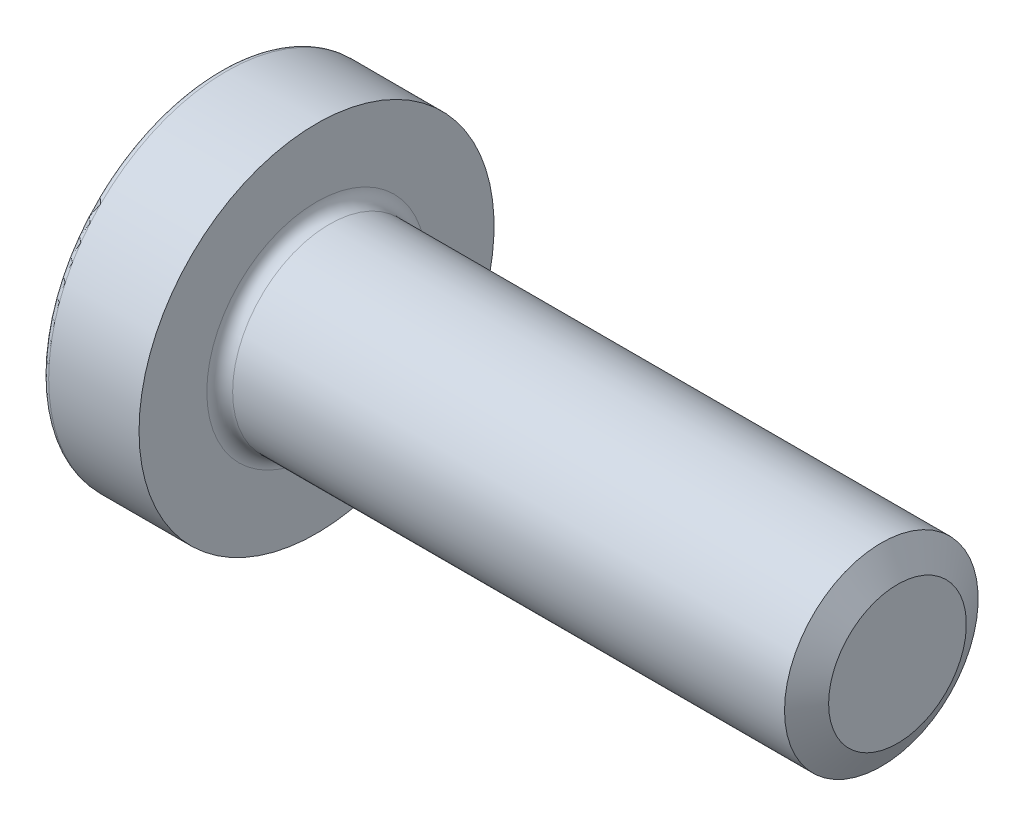
ISO-10303-21;
HEADER;
FILE_DESCRIPTION(('STEP AP214'),'2;1');
FILE_NAME('part.step','',(''),(''),'','','');
FILE_SCHEMA(('AUTOMOTIVE_DESIGN { 1 0 10303 214 1 1 1 1 }'));
ENDSEC;
DATA;
#1=APPLICATION_CONTEXT('core data for automotive mechanical design processes');
#2=APPLICATION_PROTOCOL_DEFINITION('international standard','automotive_design',2000,#1);
#3=PRODUCT_CONTEXT('',#1,'mechanical');
#4=PRODUCT('Part','Part','',(#3));
#5=PRODUCT_RELATED_PRODUCT_CATEGORY('part','',(#4));
#6=PRODUCT_DEFINITION_FORMATION('','',#4);
#7=PRODUCT_DEFINITION_CONTEXT('part definition',#1,'design');
#8=PRODUCT_DEFINITION('design','',#6,#7);
#9=PRODUCT_DEFINITION_SHAPE('','',#8);
#10=(LENGTH_UNIT() NAMED_UNIT(*) SI_UNIT(.MILLI.,.METRE.));
#11=(NAMED_UNIT(*) PLANE_ANGLE_UNIT() SI_UNIT($,.RADIAN.));
#12=(NAMED_UNIT(*) SI_UNIT($,.STERADIAN.) SOLID_ANGLE_UNIT());
#13=UNCERTAINTY_MEASURE_WITH_UNIT(LENGTH_MEASURE(1.E-05),#10,'distance_accuracy_value','');
#14=(GEOMETRIC_REPRESENTATION_CONTEXT(3) GLOBAL_UNCERTAINTY_ASSIGNED_CONTEXT((#13)) GLOBAL_UNIT_ASSIGNED_CONTEXT((#10,
#11,#12)) REPRESENTATION_CONTEXT('',''));
#15=CARTESIAN_POINT('',(0.,0.,0.));
#16=DIRECTION('',(0.,0.,1.));
#17=DIRECTION('',(1.,0.,0.));
#18=AXIS2_PLACEMENT_3D('',#15,#16,#17);
#19=CARTESIAN_POINT('',(0.,0.,0.));
#20=DIRECTION('',(-1.,0.,0.));
#21=DIRECTION('',(0.,0.,1.));
#22=AXIS2_PLACEMENT_3D('',#19,#20,#21);
#23=CYLINDRICAL_SURFACE('',#22,1.5);
#24=CARTESIAN_POINT('',(1.7,0.,0.));
#25=DIRECTION('',(-1.,0.,0.));
#26=DIRECTION('',(0.,0.,1.));
#27=AXIS2_PLACEMENT_3D('',#24,#25,#26);
#28=CIRCLE('',#27,1.5);
#29=CARTESIAN_POINT('',(1.7,0.,1.5));
#30=VERTEX_POINT('',#29);
#31=EDGE_CURVE('E145',#30,#30,#28,.T.);
#32=ORIENTED_EDGE('',*,*,#31,.F.);
#33=EDGE_LOOP('',(#32));
#34=FACE_BOUND('',#33,.T.);
#35=CARTESIAN_POINT('',(10.2500073334409,0.,0.));
#36=DIRECTION('',(-1.,0.,0.));
#37=DIRECTION('',(0.,0.,1.));
#38=AXIS2_PLACEMENT_3D('',#35,#36,#37);
#39=CIRCLE('',#38,1.5);
#40=CARTESIAN_POINT('',(10.2500073334409,0.,1.5));
#41=VERTEX_POINT('',#40);
#42=EDGE_CURVE('E282',#41,#41,#39,.T.);
#43=ORIENTED_EDGE('',*,*,#42,.T.);
#44=EDGE_LOOP('',(#43));
#45=FACE_BOUND('',#44,.T.);
#46=ADVANCED_FACE('F42',(#34,#45),#23,.T.);
#47=CARTESIAN_POINT('',(0.,0.,0.));
#48=DIRECTION('',(1.,0.,0.));
#49=DIRECTION('',(0.,0.,-1.));
#50=AXIS2_PLACEMENT_3D('',#47,#48,#49);
#51=PLANE('',#50);
#52=CARTESIAN_POINT('',(0.,0.,0.));
#53=DIRECTION('',(1.,0.,0.));
#54=DIRECTION('',(0.,0.,-1.));
#55=AXIS2_PLACEMENT_3D('',#52,#53,#54);
#56=CIRCLE('',#55,2.65);
#57=CARTESIAN_POINT('',(0.,0.,-2.65));
#58=VERTEX_POINT('',#57);
#59=EDGE_CURVE('E50',#58,#58,#56,.F.);
#60=ORIENTED_EDGE('',*,*,#59,.T.);
#61=EDGE_LOOP('',(#60));
#62=FACE_BOUND('',#61,.T.);
#63=DIRECTION('',(0.,0.866025403784439,-0.5));
#64=VECTOR('',#63,1.);
#65=CARTESIAN_POINT('',(0.,0.,1.435));
#66=LINE('',#65,#64);
#67=CARTESIAN_POINT('',(0.,0.,1.435));
#68=VERTEX_POINT('',#67);
#69=CARTESIAN_POINT('',(0.,1.24274645443067,0.717499999999999));
#70=VERTEX_POINT('',#69);
#71=EDGE_CURVE('E131',#68,#70,#66,.T.);
#72=ORIENTED_EDGE('',*,*,#71,.F.);
#73=DIRECTION('',(0.,0.866025403784439,0.5));
#74=VECTOR('',#73,1.);
#75=CARTESIAN_POINT('',(0.,-1.24274645443067,0.7175));
#76=LINE('',#75,#74);
#77=CARTESIAN_POINT('',(0.,-1.24274645443067,0.7175));
#78=VERTEX_POINT('',#77);
#79=EDGE_CURVE('E57',#78,#68,#76,.T.);
#80=ORIENTED_EDGE('',*,*,#79,.F.);
#81=DIRECTION('',(0.,0.,1.));
#82=VECTOR('',#81,1.);
#83=CARTESIAN_POINT('',(0.,-1.24274645443067,-0.7175));
#84=LINE('',#83,#82);
#85=CARTESIAN_POINT('',(0.,-1.24274645443067,-0.7175));
#86=VERTEX_POINT('',#85);
#87=EDGE_CURVE('E141',#86,#78,#84,.T.);
#88=ORIENTED_EDGE('',*,*,#87,.F.);
#89=DIRECTION('',(0.,-0.866025403784439,0.5));
#90=VECTOR('',#89,1.);
#91=CARTESIAN_POINT('',(0.,0.,-1.435));
#92=LINE('',#91,#90);
#93=CARTESIAN_POINT('',(0.,0.,-1.435));
#94=VERTEX_POINT('',#93);
#95=EDGE_CURVE('E139',#94,#86,#92,.T.);
#96=ORIENTED_EDGE('',*,*,#95,.F.);
#97=DIRECTION('',(0.,-0.866025403784439,-0.5));
#98=VECTOR('',#97,1.);
#99=CARTESIAN_POINT('',(0.,1.24274645443067,-0.7175));
#100=LINE('',#99,#98);
#101=CARTESIAN_POINT('',(0.,1.24274645443067,-0.7175));
#102=VERTEX_POINT('',#101);
#103=EDGE_CURVE('E105',#102,#94,#100,.T.);
#104=ORIENTED_EDGE('',*,*,#103,.F.);
#105=DIRECTION('',(0.,0.,-1.));
#106=VECTOR('',#105,1.);
#107=CARTESIAN_POINT('',(0.,1.24274645443067,0.717499999999999));
#108=LINE('',#107,#106);
#109=EDGE_CURVE('E135',#70,#102,#108,.T.);
#110=ORIENTED_EDGE('',*,*,#109,.F.);
#111=EDGE_LOOP('',(#72,#80,#88,#96,#104,#110));
#112=FACE_BOUND('',#111,.T.);
#113=ADVANCED_FACE('F162',(#62,#112),#51,.F.);
#114=CARTESIAN_POINT('',(0.,0.,0.));
#115=DIRECTION('',(-1.,0.,0.));
#116=DIRECTION('',(0.,0.,1.));
#117=AXIS2_PLACEMENT_3D('',#114,#115,#116);
#118=CYLINDRICAL_SURFACE('',#117,2.75);
#119=CARTESIAN_POINT('',(0.1,0.,0.));
#120=DIRECTION('',(1.,0.,0.));
#121=DIRECTION('',(0.,0.,-1.));
#122=AXIS2_PLACEMENT_3D('',#119,#120,#121);
#123=CIRCLE('',#122,2.75);
#124=CARTESIAN_POINT('',(0.1,0.,-2.75));
#125=VERTEX_POINT('',#124);
#126=EDGE_CURVE('E11',#125,#125,#123,.T.);
#127=ORIENTED_EDGE('',*,*,#126,.T.);
#128=EDGE_LOOP('',(#127));
#129=FACE_BOUND('',#128,.T.);
#130=CARTESIAN_POINT('',(1.5,0.,0.));
#131=DIRECTION('',(-1.,0.,0.));
#132=DIRECTION('',(0.,0.,1.));
#133=AXIS2_PLACEMENT_3D('',#130,#131,#132);
#134=CIRCLE('',#133,2.75);
#135=CARTESIAN_POINT('',(1.5,0.,2.75));
#136=VERTEX_POINT('',#135);
#137=EDGE_CURVE('E156',#136,#136,#134,.T.);
#138=ORIENTED_EDGE('',*,*,#137,.T.);
#139=EDGE_LOOP('',(#138));
#140=FACE_BOUND('',#139,.T.);
#141=ADVANCED_FACE('F181',(#129,#140),#118,.T.);
#142=CARTESIAN_POINT('',(1.5,2.75,0.));
#143=DIRECTION('',(-1.,0.,0.));
#144=DIRECTION('',(0.,0.,1.));
#145=AXIS2_PLACEMENT_3D('',#142,#143,#144);
#146=PLANE('',#145);
#147=ORIENTED_EDGE('',*,*,#137,.F.);
#148=EDGE_LOOP('',(#147));
#149=FACE_BOUND('',#148,.T.);
#150=CARTESIAN_POINT('',(1.5,0.,0.));
#151=DIRECTION('',(-1.,0.,0.));
#152=DIRECTION('',(0.,0.,1.));
#153=AXIS2_PLACEMENT_3D('',#150,#151,#152);
#154=CIRCLE('',#153,1.7);
#155=CARTESIAN_POINT('',(1.5,0.,1.7));
#156=VERTEX_POINT('',#155);
#157=EDGE_CURVE('E153',#156,#156,#154,.T.);
#158=ORIENTED_EDGE('',*,*,#157,.T.);
#159=EDGE_LOOP('',(#158));
#160=FACE_BOUND('',#159,.T.);
#161=ADVANCED_FACE('F190',(#149,#160),#146,.F.);
#162=CARTESIAN_POINT('',(1.7,0.,0.));
#163=DIRECTION('',(-1.,0.,0.));
#164=DIRECTION('',(0.,0.,1.));
#165=AXIS2_PLACEMENT_3D('',#162,#163,#164);
#166=TOROIDAL_SURFACE('',#165,1.7,0.2);
#167=ORIENTED_EDGE('',*,*,#157,.F.);
#168=EDGE_LOOP('',(#167));
#169=FACE_BOUND('',#168,.T.);
#170=ORIENTED_EDGE('',*,*,#31,.T.);
#171=EDGE_LOOP('',(#170));
#172=FACE_BOUND('',#171,.T.);
#173=ADVANCED_FACE('F186',(#169,#172),#166,.F.);
#174=CARTESIAN_POINT('',(1.3,-1.24274645443067,0.7175));
#175=DIRECTION('',(0.,-0.5,0.866025403784439));
#176=DIRECTION('',(0.,-0.866025403784439,-0.5));
#177=AXIS2_PLACEMENT_3D('',#174,#175,#176);
#178=PLANE('',#177);
#179=ORIENTED_EDGE('',*,*,#79,.T.);
#180=DIRECTION('',(-1.,0.,0.));
#181=VECTOR('',#180,1.);
#182=CARTESIAN_POINT('',(1.3,0.,1.435));
#183=LINE('',#182,#181);
#184=CARTESIAN_POINT('',(1.3,0.,1.435));
#185=VERTEX_POINT('',#184);
#186=EDGE_CURVE('E87',#185,#68,#183,.T.);
#187=ORIENTED_EDGE('',*,*,#186,.F.);
#188=DIRECTION('',(0.,0.866025403784439,0.5));
#189=VECTOR('',#188,1.);
#190=CARTESIAN_POINT('',(1.3,-1.24274645443067,0.7175));
#191=LINE('',#190,#189);
#192=CARTESIAN_POINT('',(1.3,-1.24274645443067,0.7175));
#193=VERTEX_POINT('',#192);
#194=EDGE_CURVE('E143',#193,#185,#191,.T.);
#195=ORIENTED_EDGE('',*,*,#194,.F.);
#196=DIRECTION('',(-1.,0.,0.));
#197=VECTOR('',#196,1.);
#198=CARTESIAN_POINT('',(1.3,-1.24274645443067,0.7175));
#199=LINE('',#198,#197);
#200=EDGE_CURVE('E65',#193,#78,#199,.T.);
#201=ORIENTED_EDGE('',*,*,#200,.T.);
#202=EDGE_LOOP('',(#179,#187,#195,#201));
#203=FACE_BOUND('',#202,.T.);
#204=ADVANCED_FACE('F189',(#203),#178,.F.);
#205=CARTESIAN_POINT('',(1.3,-1.24274645443067,-0.7175));
#206=DIRECTION('',(0.,-1.,0.));
#207=DIRECTION('',(0.,0.,-1.));
#208=AXIS2_PLACEMENT_3D('',#205,#206,#207);
#209=PLANE('',#208);
#210=ORIENTED_EDGE('',*,*,#87,.T.);
#211=ORIENTED_EDGE('',*,*,#200,.F.);
#212=DIRECTION('',(0.,0.,1.));
#213=VECTOR('',#212,1.);
#214=CARTESIAN_POINT('',(1.3,-1.24274645443067,-0.7175));
#215=LINE('',#214,#213);
#216=CARTESIAN_POINT('',(1.3,-1.24274645443067,-0.7175));
#217=VERTEX_POINT('',#216);
#218=EDGE_CURVE('E117',#217,#193,#215,.T.);
#219=ORIENTED_EDGE('',*,*,#218,.F.);
#220=DIRECTION('',(-1.,0.,0.));
#221=VECTOR('',#220,1.);
#222=CARTESIAN_POINT('',(1.3,-1.24274645443067,-0.7175));
#223=LINE('',#222,#221);
#224=EDGE_CURVE('E109',#217,#86,#223,.T.);
#225=ORIENTED_EDGE('',*,*,#224,.T.);
#226=EDGE_LOOP('',(#210,#211,#219,#225));
#227=FACE_BOUND('',#226,.T.);
#228=ADVANCED_FACE('F220',(#227),#209,.F.);
#229=CARTESIAN_POINT('',(1.3,0.,-1.435));
#230=DIRECTION('',(0.,-0.5,-0.866025403784439));
#231=DIRECTION('',(0.,0.866025403784439,-0.5));
#232=AXIS2_PLACEMENT_3D('',#229,#230,#231);
#233=PLANE('',#232);
#234=ORIENTED_EDGE('',*,*,#95,.T.);
#235=ORIENTED_EDGE('',*,*,#224,.F.);
#236=DIRECTION('',(0.,-0.866025403784439,0.5));
#237=VECTOR('',#236,1.);
#238=CARTESIAN_POINT('',(1.3,0.,-1.435));
#239=LINE('',#238,#237);
#240=CARTESIAN_POINT('',(1.3,0.,-1.435));
#241=VERTEX_POINT('',#240);
#242=EDGE_CURVE('E113',#241,#217,#239,.T.);
#243=ORIENTED_EDGE('',*,*,#242,.F.);
#244=DIRECTION('',(-1.,0.,0.));
#245=VECTOR('',#244,1.);
#246=CARTESIAN_POINT('',(1.3,0.,-1.435));
#247=LINE('',#246,#245);
#248=EDGE_CURVE('E98',#241,#94,#247,.T.);
#249=ORIENTED_EDGE('',*,*,#248,.T.);
#250=EDGE_LOOP('',(#234,#235,#243,#249));
#251=FACE_BOUND('',#250,.T.);
#252=ADVANCED_FACE('F114',(#251),#233,.F.);
#253=CARTESIAN_POINT('',(1.3,1.24274645443067,-0.7175));
#254=DIRECTION('',(0.,0.5,-0.866025403784439));
#255=DIRECTION('',(0.,0.866025403784439,0.5));
#256=AXIS2_PLACEMENT_3D('',#253,#254,#255);
#257=PLANE('',#256);
#258=ORIENTED_EDGE('',*,*,#103,.T.);
#259=ORIENTED_EDGE('',*,*,#248,.F.);
#260=DIRECTION('',(0.,-0.866025403784439,-0.5));
#261=VECTOR('',#260,1.);
#262=CARTESIAN_POINT('',(1.3,1.24274645443067,-0.7175));
#263=LINE('',#262,#261);
#264=CARTESIAN_POINT('',(1.3,1.24274645443067,-0.7175));
#265=VERTEX_POINT('',#264);
#266=EDGE_CURVE('E102',#265,#241,#263,.T.);
#267=ORIENTED_EDGE('',*,*,#266,.F.);
#268=DIRECTION('',(-1.,0.,0.));
#269=VECTOR('',#268,1.);
#270=CARTESIAN_POINT('',(1.3,1.24274645443067,-0.7175));
#271=LINE('',#270,#269);
#272=EDGE_CURVE('E110',#265,#102,#271,.T.);
#273=ORIENTED_EDGE('',*,*,#272,.T.);
#274=EDGE_LOOP('',(#258,#259,#267,#273));
#275=FACE_BOUND('',#274,.T.);
#276=ADVANCED_FACE('F100',(#275),#257,.F.);
#277=CARTESIAN_POINT('',(1.3,1.24274645443067,0.717499999999999));
#278=DIRECTION('',(0.,1.,0.));
#279=DIRECTION('',(0.,0.,1.));
#280=AXIS2_PLACEMENT_3D('',#277,#278,#279);
#281=PLANE('',#280);
#282=ORIENTED_EDGE('',*,*,#109,.T.);
#283=ORIENTED_EDGE('',*,*,#272,.F.);
#284=DIRECTION('',(0.,0.,-1.));
#285=VECTOR('',#284,1.);
#286=CARTESIAN_POINT('',(1.3,1.24274645443067,0.717499999999999));
#287=LINE('',#286,#285);
#288=CARTESIAN_POINT('',(1.3,1.24274645443067,0.717499999999999));
#289=VERTEX_POINT('',#288);
#290=EDGE_CURVE('E123',#289,#265,#287,.T.);
#291=ORIENTED_EDGE('',*,*,#290,.F.);
#292=DIRECTION('',(-1.,0.,0.));
#293=VECTOR('',#292,1.);
#294=CARTESIAN_POINT('',(1.3,1.24274645443067,0.717499999999999));
#295=LINE('',#294,#293);
#296=EDGE_CURVE('E148',#289,#70,#295,.T.);
#297=ORIENTED_EDGE('',*,*,#296,.T.);
#298=EDGE_LOOP('',(#282,#283,#291,#297));
#299=FACE_BOUND('',#298,.T.);
#300=ADVANCED_FACE('F238',(#299),#281,.F.);
#301=CARTESIAN_POINT('',(1.3,0.,1.435));
#302=DIRECTION('',(0.,0.5,0.866025403784439));
#303=DIRECTION('',(0.,-0.866025403784439,0.5));
#304=AXIS2_PLACEMENT_3D('',#301,#302,#303);
#305=PLANE('',#304);
#306=ORIENTED_EDGE('',*,*,#71,.T.);
#307=ORIENTED_EDGE('',*,*,#296,.F.);
#308=DIRECTION('',(0.,0.866025403784439,-0.5));
#309=VECTOR('',#308,1.);
#310=CARTESIAN_POINT('',(1.3,0.,1.435));
#311=LINE('',#310,#309);
#312=EDGE_CURVE('E125',#185,#289,#311,.T.);
#313=ORIENTED_EDGE('',*,*,#312,.F.);
#314=ORIENTED_EDGE('',*,*,#186,.T.);
#315=EDGE_LOOP('',(#306,#307,#313,#314));
#316=FACE_BOUND('',#315,.T.);
#317=ADVANCED_FACE('F245',(#316),#305,.F.);
#318=CARTESIAN_POINT('',(1.3,-1.24274645443067,0.7175));
#319=DIRECTION('',(1.,0.,0.));
#320=DIRECTION('',(0.,0.,-1.));
#321=AXIS2_PLACEMENT_3D('',#318,#319,#320);
#322=PLANE('',#321);
#323=ORIENTED_EDGE('',*,*,#194,.T.);
#324=ORIENTED_EDGE('',*,*,#312,.T.);
#325=ORIENTED_EDGE('',*,*,#290,.T.);
#326=ORIENTED_EDGE('',*,*,#266,.T.);
#327=ORIENTED_EDGE('',*,*,#242,.T.);
#328=ORIENTED_EDGE('',*,*,#218,.T.);
#329=EDGE_LOOP('',(#323,#324,#325,#326,#327,#328));
#330=FACE_BOUND('',#329,.T.);
#331=ADVANCED_FACE('F120',(#330),#322,.F.);
#332=CARTESIAN_POINT('',(10.2500073334409,0.,0.));
#333=DIRECTION('',(-1.,0.,0.));
#334=DIRECTION('',(0.,0.,1.));
#335=AXIS2_PLACEMENT_3D('',#332,#333,#334);
#336=CONICAL_SURFACE('',#335,1.5,1.04719755119659);
#337=CARTESIAN_POINT('',(10.5,0.,0.));
#338=DIRECTION('',(-1.,0.,0.));
#339=DIRECTION('',(0.,0.,1.));
#340=AXIS2_PLACEMENT_3D('',#337,#338,#339);
#341=CIRCLE('',#340,1.067);
#342=CARTESIAN_POINT('',(10.5,0.,1.067));
#343=VERTEX_POINT('',#342);
#344=EDGE_CURVE('E132',#343,#343,#341,.T.);
#345=ORIENTED_EDGE('',*,*,#344,.T.);
#346=EDGE_LOOP('',(#345));
#347=FACE_BOUND('',#346,.T.);
#348=ORIENTED_EDGE('',*,*,#42,.F.);
#349=EDGE_LOOP('',(#348));
#350=FACE_BOUND('',#349,.T.);
#351=ADVANCED_FACE('F171',(#347,#350),#336,.T.);
#352=CARTESIAN_POINT('',(10.5,1.5,0.));
#353=DIRECTION('',(-1.,0.,0.));
#354=DIRECTION('',(0.,0.,1.));
#355=AXIS2_PLACEMENT_3D('',#352,#353,#354);
#356=PLANE('',#355);
#357=ORIENTED_EDGE('',*,*,#344,.F.);
#358=EDGE_LOOP('',(#357));
#359=FACE_BOUND('',#358,.T.);
#360=ADVANCED_FACE('F166',(#359),#356,.F.);
#361=CARTESIAN_POINT('',(0.1,0.,0.));
#362=DIRECTION('',(1.,0.,0.));
#363=DIRECTION('',(0.,0.,-1.));
#364=AXIS2_PLACEMENT_3D('',#361,#362,#363);
#365=TOROIDAL_SURFACE('',#364,2.65,0.1);
#366=ORIENTED_EDGE('',*,*,#126,.F.);
#367=EDGE_LOOP('',(#366));
#368=FACE_BOUND('',#367,.T.);
#369=ORIENTED_EDGE('',*,*,#59,.F.);
#370=EDGE_LOOP('',(#369));
#371=FACE_BOUND('',#370,.T.);
#372=ADVANCED_FACE('F44',(#368,#371),#365,.T.);
#373=CLOSED_SHELL('',(#46,#113,#141,#161,#173,#204,#228,#252,#276,#300,#317,#331,#351,#360,#372));
#374=MANIFOLD_SOLID_BREP('B2',#373);
#375=ADVANCED_BREP_SHAPE_REPRESENTATION('',(#18,#374),#14);
#376=SHAPE_DEFINITION_REPRESENTATION(#9,#375);
ENDSEC;
END-ISO-10303-21;
